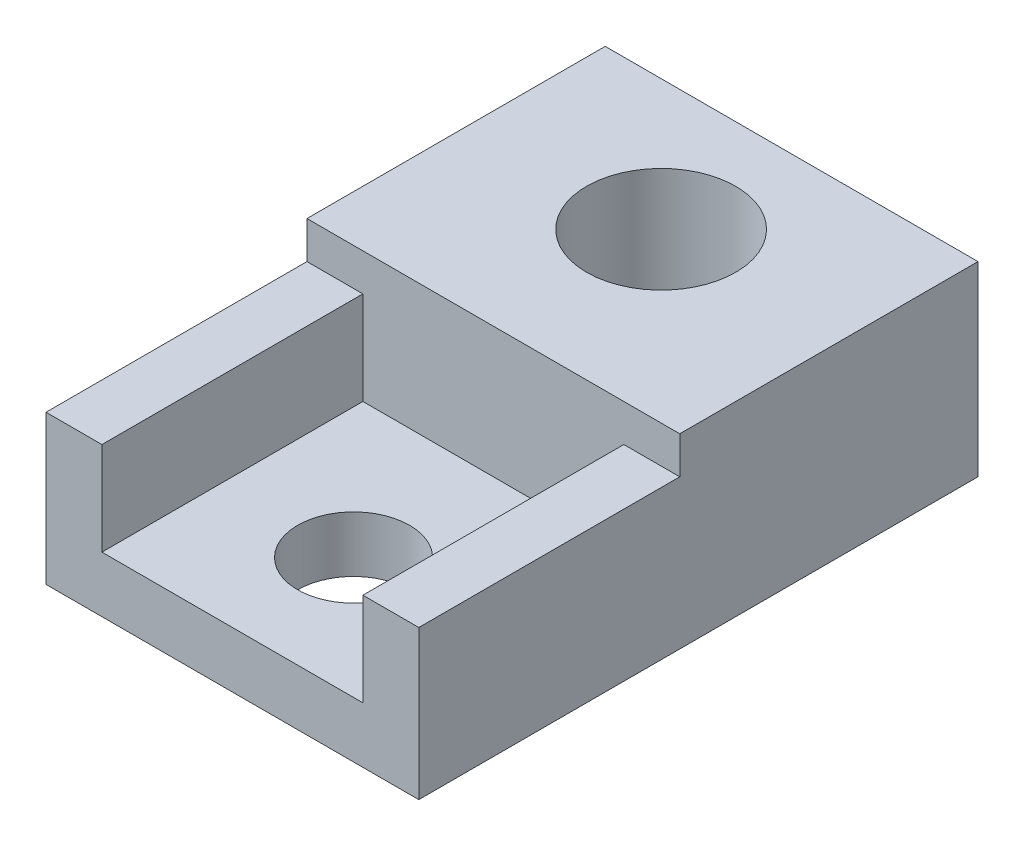
ISO-10303-21;
HEADER;
FILE_DESCRIPTION(('STEP AP214'),'2;1');
FILE_NAME('part.step','',(''),(''),'','','');
FILE_SCHEMA(('AUTOMOTIVE_DESIGN { 1 0 10303 214 1 1 1 1 }'));
ENDSEC;
DATA;
#1=APPLICATION_CONTEXT('core data for automotive mechanical design processes');
#2=APPLICATION_PROTOCOL_DEFINITION('international standard','automotive_design',2000,#1);
#3=PRODUCT_CONTEXT('',#1,'mechanical');
#4=PRODUCT('Part','Part','',(#3));
#5=PRODUCT_RELATED_PRODUCT_CATEGORY('part','',(#4));
#6=PRODUCT_DEFINITION_FORMATION('','',#4);
#7=PRODUCT_DEFINITION_CONTEXT('part definition',#1,'design');
#8=PRODUCT_DEFINITION('design','',#6,#7);
#9=PRODUCT_DEFINITION_SHAPE('','',#8);
#10=(LENGTH_UNIT() NAMED_UNIT(*) SI_UNIT(.MILLI.,.METRE.));
#11=(NAMED_UNIT(*) PLANE_ANGLE_UNIT() SI_UNIT($,.RADIAN.));
#12=(NAMED_UNIT(*) SI_UNIT($,.STERADIAN.) SOLID_ANGLE_UNIT());
#13=UNCERTAINTY_MEASURE_WITH_UNIT(LENGTH_MEASURE(1.E-05),#10,'distance_accuracy_value','');
#14=(GEOMETRIC_REPRESENTATION_CONTEXT(3) GLOBAL_UNCERTAINTY_ASSIGNED_CONTEXT((#13)) GLOBAL_UNIT_ASSIGNED_CONTEXT((#10,
#11,#12)) REPRESENTATION_CONTEXT('',''));
#15=CARTESIAN_POINT('',(0.,0.,0.));
#16=DIRECTION('',(0.,0.,1.));
#17=DIRECTION('',(1.,0.,0.));
#18=AXIS2_PLACEMENT_3D('',#15,#16,#17);
#19=CARTESIAN_POINT('',(0.,3.,0.));
#20=DIRECTION('',(0.,-1.,0.));
#21=DIRECTION('',(0.,0.,-1.));
#22=AXIS2_PLACEMENT_3D('',#19,#20,#21);
#23=PLANE('',#22);
#24=CARTESIAN_POINT('',(0.,3.,8.5));
#25=DIRECTION('',(0.,-1.,0.));
#26=DIRECTION('',(0.,0.,-1.));
#27=AXIS2_PLACEMENT_3D('',#24,#25,#26);
#28=CIRCLE('',#27,3.);
#29=CARTESIAN_POINT('',(0.,3.,5.5));
#30=VERTEX_POINT('',#29);
#31=EDGE_CURVE('E213',#30,#30,#28,.T.);
#32=ORIENTED_EDGE('',*,*,#31,.T.);
#33=EDGE_LOOP('',(#32));
#34=FACE_BOUND('',#33,.T.);
#35=DIRECTION('',(-1.,0.,0.));
#36=VECTOR('',#35,1.);
#37=CARTESIAN_POINT('',(7.,3.,15.));
#38=LINE('',#37,#36);
#39=CARTESIAN_POINT('',(7.,3.,15.));
#40=VERTEX_POINT('',#39);
#41=CARTESIAN_POINT('',(-7.,3.,15.));
#42=VERTEX_POINT('',#41);
#43=EDGE_CURVE('E317',#40,#42,#38,.T.);
#44=ORIENTED_EDGE('',*,*,#43,.F.);
#45=DIRECTION('',(0.,0.,-1.));
#46=VECTOR('',#45,1.);
#47=CARTESIAN_POINT('',(7.,3.,0.));
#48=LINE('',#47,#46);
#49=CARTESIAN_POINT('',(7.,3.,0.999999999999997));
#50=VERTEX_POINT('',#49);
#51=EDGE_CURVE('E174',#40,#50,#48,.T.);
#52=ORIENTED_EDGE('',*,*,#51,.T.);
#53=DIRECTION('',(1.,0.,0.));
#54=VECTOR('',#53,1.);
#55=CARTESIAN_POINT('',(0.,3.,0.999999999999997));
#56=LINE('',#55,#54);
#57=CARTESIAN_POINT('',(-7.,3.,0.999999999999997));
#58=VERTEX_POINT('',#57);
#59=EDGE_CURVE('E188',#58,#50,#56,.T.);
#60=ORIENTED_EDGE('',*,*,#59,.F.);
#61=DIRECTION('',(0.,0.,-1.));
#62=VECTOR('',#61,1.);
#63=CARTESIAN_POINT('',(-7.,3.,0.));
#64=LINE('',#63,#62);
#65=EDGE_CURVE('E287',#42,#58,#64,.T.);
#66=ORIENTED_EDGE('',*,*,#65,.F.);
#67=EDGE_LOOP('',(#44,#52,#60,#66));
#68=FACE_BOUND('',#67,.T.);
#69=ADVANCED_FACE('F40',(#34,#68),#23,.F.);
#70=CARTESIAN_POINT('',(0.,0.,0.));
#71=DIRECTION('',(0.,-1.,0.));
#72=DIRECTION('',(0.,0.,-1.));
#73=AXIS2_PLACEMENT_3D('',#70,#71,#72);
#74=PLANE('',#73);
#75=CARTESIAN_POINT('',(0.,0.,8.5));
#76=DIRECTION('',(0.,-1.,0.));
#77=DIRECTION('',(0.,0.,-1.));
#78=AXIS2_PLACEMENT_3D('',#75,#76,#77);
#79=CIRCLE('',#78,3.);
#80=CARTESIAN_POINT('',(0.,0.,5.5));
#81=VERTEX_POINT('',#80);
#82=EDGE_CURVE('E44',#81,#81,#79,.T.);
#83=ORIENTED_EDGE('',*,*,#82,.F.);
#84=EDGE_LOOP('',(#83));
#85=FACE_BOUND('',#84,.T.);
#86=DIRECTION('',(0.,0.,-1.));
#87=VECTOR('',#86,1.);
#88=CARTESIAN_POINT('',(10.,0.,15.));
#89=LINE('',#88,#87);
#90=CARTESIAN_POINT('',(10.,0.,15.));
#91=VERTEX_POINT('',#90);
#92=CARTESIAN_POINT('',(10.,0.,-15.));
#93=VERTEX_POINT('',#92);
#94=EDGE_CURVE('E262',#91,#93,#89,.T.);
#95=ORIENTED_EDGE('',*,*,#94,.F.);
#96=DIRECTION('',(1.,0.,0.));
#97=VECTOR('',#96,1.);
#98=CARTESIAN_POINT('',(-10.,0.,15.));
#99=LINE('',#98,#97);
#100=CARTESIAN_POINT('',(-10.,0.,15.));
#101=VERTEX_POINT('',#100);
#102=EDGE_CURVE('E148',#101,#91,#99,.T.);
#103=ORIENTED_EDGE('',*,*,#102,.F.);
#104=DIRECTION('',(0.,0.,1.));
#105=VECTOR('',#104,1.);
#106=CARTESIAN_POINT('',(-10.,0.,15.));
#107=LINE('',#106,#105);
#108=CARTESIAN_POINT('',(-10.,0.,-15.));
#109=VERTEX_POINT('',#108);
#110=EDGE_CURVE('E270',#109,#101,#107,.T.);
#111=ORIENTED_EDGE('',*,*,#110,.F.);
#112=DIRECTION('',(-1.,0.,0.));
#113=VECTOR('',#112,1.);
#114=CARTESIAN_POINT('',(-10.,0.,-15.));
#115=LINE('',#114,#113);
#116=CARTESIAN_POINT('',(-2.5,0.,-15.));
#117=VERTEX_POINT('',#116);
#118=EDGE_CURVE('E265',#117,#109,#115,.T.);
#119=ORIENTED_EDGE('',*,*,#118,.F.);
#120=DIRECTION('',(0.,0.,-1.));
#121=VECTOR('',#120,1.);
#122=CARTESIAN_POINT('',(-2.5,0.,-15.));
#123=LINE('',#122,#121);
#124=CARTESIAN_POINT('',(-2.5,0.,-3.));
#125=VERTEX_POINT('',#124);
#126=EDGE_CURVE('E227',#125,#117,#123,.T.);
#127=ORIENTED_EDGE('',*,*,#126,.F.);
#128=DIRECTION('',(-1.,0.,0.));
#129=VECTOR('',#128,1.);
#130=CARTESIAN_POINT('',(-2.5,0.,-3.));
#131=LINE('',#130,#129);
#132=CARTESIAN_POINT('',(2.5,0.,-3.));
#133=VERTEX_POINT('',#132);
#134=EDGE_CURVE('E240',#133,#125,#131,.T.);
#135=ORIENTED_EDGE('',*,*,#134,.F.);
#136=DIRECTION('',(0.,0.,1.));
#137=VECTOR('',#136,1.);
#138=CARTESIAN_POINT('',(2.5,0.,-15.));
#139=LINE('',#138,#137);
#140=CARTESIAN_POINT('',(2.5,0.,-15.));
#141=VERTEX_POINT('',#140);
#142=EDGE_CURVE('E221',#141,#133,#139,.T.);
#143=ORIENTED_EDGE('',*,*,#142,.F.);
#144=EDGE_CURVE('E266',#93,#141,#115,.T.);
#145=ORIENTED_EDGE('',*,*,#144,.F.);
#146=EDGE_LOOP('',(#95,#103,#111,#119,#127,#135,#143,#145));
#147=FACE_BOUND('',#146,.T.);
#148=ADVANCED_FACE('F284',(#85,#147),#74,.T.);
#149=CARTESIAN_POINT('',(10.,3.,15.));
#150=DIRECTION('',(-1.,0.,0.));
#151=DIRECTION('',(0.,0.,1.));
#152=AXIS2_PLACEMENT_3D('',#149,#150,#151);
#153=PLANE('',#152);
#154=DIRECTION('',(0.,1.,0.));
#155=VECTOR('',#154,1.);
#156=CARTESIAN_POINT('',(10.,0.,15.));
#157=LINE('',#156,#155);
#158=CARTESIAN_POINT('',(10.,8.,15.));
#159=VERTEX_POINT('',#158);
#160=EDGE_CURVE('E142',#91,#159,#157,.T.);
#161=ORIENTED_EDGE('',*,*,#160,.F.);
#162=ORIENTED_EDGE('',*,*,#94,.T.);
#163=DIRECTION('',(0.,-1.,0.));
#164=VECTOR('',#163,1.);
#165=CARTESIAN_POINT('',(10.,3.,-15.));
#166=LINE('',#165,#164);
#167=CARTESIAN_POINT('',(10.,10.,-15.));
#168=VERTEX_POINT('',#167);
#169=EDGE_CURVE('E11',#168,#93,#166,.T.);
#170=ORIENTED_EDGE('',*,*,#169,.F.);
#171=DIRECTION('',(0.,0.,-1.));
#172=VECTOR('',#171,1.);
#173=CARTESIAN_POINT('',(10.,10.,0.));
#174=LINE('',#173,#172);
#175=CARTESIAN_POINT('',(10.,10.,0.999999999999997));
#176=VERTEX_POINT('',#175);
#177=EDGE_CURVE('E202',#176,#168,#174,.T.);
#178=ORIENTED_EDGE('',*,*,#177,.F.);
#179=DIRECTION('',(0.,-1.,0.));
#180=VECTOR('',#179,1.);
#181=CARTESIAN_POINT('',(10.,35.6124969497314,0.999999999999997));
#182=LINE('',#181,#180);
#183=CARTESIAN_POINT('',(10.,8.,0.999999999999997));
#184=VERTEX_POINT('',#183);
#185=EDGE_CURVE('E166',#176,#184,#182,.T.);
#186=ORIENTED_EDGE('',*,*,#185,.T.);
#187=DIRECTION('',(0.,0.,-1.));
#188=VECTOR('',#187,1.);
#189=CARTESIAN_POINT('',(10.,8.,0.));
#190=LINE('',#189,#188);
#191=EDGE_CURVE('E158',#159,#184,#190,.T.);
#192=ORIENTED_EDGE('',*,*,#191,.F.);
#193=EDGE_LOOP('',(#161,#162,#170,#178,#186,#192));
#194=FACE_BOUND('',#193,.T.);
#195=ADVANCED_FACE('F42',(#194),#153,.F.);
#196=CARTESIAN_POINT('',(-10.,3.,15.));
#197=DIRECTION('',(1.,0.,0.));
#198=DIRECTION('',(0.,0.,-1.));
#199=AXIS2_PLACEMENT_3D('',#196,#197,#198);
#200=PLANE('',#199);
#201=DIRECTION('',(0.,-1.,0.));
#202=VECTOR('',#201,1.);
#203=CARTESIAN_POINT('',(-10.,8.,15.));
#204=LINE('',#203,#202);
#205=CARTESIAN_POINT('',(-10.,8.,15.));
#206=VERTEX_POINT('',#205);
#207=EDGE_CURVE('E288',#206,#101,#204,.T.);
#208=ORIENTED_EDGE('',*,*,#207,.F.);
#209=DIRECTION('',(0.,0.,1.));
#210=VECTOR('',#209,1.);
#211=CARTESIAN_POINT('',(-10.,8.,0.));
#212=LINE('',#211,#210);
#213=CARTESIAN_POINT('',(-10.,8.,0.999999999999997));
#214=VERTEX_POINT('',#213);
#215=EDGE_CURVE('E302',#214,#206,#212,.T.);
#216=ORIENTED_EDGE('',*,*,#215,.F.);
#217=DIRECTION('',(0.,-1.,0.));
#218=VECTOR('',#217,1.);
#219=CARTESIAN_POINT('',(-10.,35.6124969497314,0.999999999999997));
#220=LINE('',#219,#218);
#221=CARTESIAN_POINT('',(-10.,10.,0.999999999999997));
#222=VERTEX_POINT('',#221);
#223=EDGE_CURVE('E193',#222,#214,#220,.T.);
#224=ORIENTED_EDGE('',*,*,#223,.F.);
#225=DIRECTION('',(0.,0.,1.));
#226=VECTOR('',#225,1.);
#227=CARTESIAN_POINT('',(-10.,10.,0.));
#228=LINE('',#227,#226);
#229=CARTESIAN_POINT('',(-10.,10.,-15.));
#230=VERTEX_POINT('',#229);
#231=EDGE_CURVE('E194',#230,#222,#228,.T.);
#232=ORIENTED_EDGE('',*,*,#231,.F.);
#233=DIRECTION('',(0.,-1.,0.));
#234=VECTOR('',#233,1.);
#235=CARTESIAN_POINT('',(-10.,3.,-15.));
#236=LINE('',#235,#234);
#237=EDGE_CURVE('E50',#230,#109,#236,.T.);
#238=ORIENTED_EDGE('',*,*,#237,.T.);
#239=ORIENTED_EDGE('',*,*,#110,.T.);
#240=EDGE_LOOP('',(#208,#216,#224,#232,#238,#239));
#241=FACE_BOUND('',#240,.T.);
#242=ADVANCED_FACE('F280',(#241),#200,.F.);
#243=CARTESIAN_POINT('',(7.,8.,0.));
#244=DIRECTION('',(-1.,0.,0.));
#245=DIRECTION('',(0.,0.,1.));
#246=AXIS2_PLACEMENT_3D('',#243,#244,#245);
#247=PLANE('',#246);
#248=ORIENTED_EDGE('',*,*,#51,.F.);
#249=DIRECTION('',(0.,-1.,0.));
#250=VECTOR('',#249,1.);
#251=CARTESIAN_POINT('',(7.,8.,15.));
#252=LINE('',#251,#250);
#253=CARTESIAN_POINT('',(7.,8.,15.));
#254=VERTEX_POINT('',#253);
#255=EDGE_CURVE('E162',#254,#40,#252,.T.);
#256=ORIENTED_EDGE('',*,*,#255,.F.);
#257=DIRECTION('',(0.,0.,-1.));
#258=VECTOR('',#257,1.);
#259=CARTESIAN_POINT('',(7.,8.,0.));
#260=LINE('',#259,#258);
#261=CARTESIAN_POINT('',(7.,8.,0.999999999999997));
#262=VERTEX_POINT('',#261);
#263=EDGE_CURVE('E160',#254,#262,#260,.T.);
#264=ORIENTED_EDGE('',*,*,#263,.T.);
#265=DIRECTION('',(0.,-1.,0.));
#266=VECTOR('',#265,1.);
#267=CARTESIAN_POINT('',(7.,8.,0.999999999999997));
#268=LINE('',#267,#266);
#269=EDGE_CURVE('E172',#262,#50,#268,.T.);
#270=ORIENTED_EDGE('',*,*,#269,.T.);
#271=EDGE_LOOP('',(#248,#256,#264,#270));
#272=FACE_BOUND('',#271,.T.);
#273=ADVANCED_FACE('F319',(#272),#247,.T.);
#274=CARTESIAN_POINT('',(0.,8.,0.));
#275=DIRECTION('',(0.,1.,0.));
#276=DIRECTION('',(0.,0.,1.));
#277=AXIS2_PLACEMENT_3D('',#274,#275,#276);
#278=PLANE('',#277);
#279=ORIENTED_EDGE('',*,*,#263,.F.);
#280=DIRECTION('',(-1.,0.,0.));
#281=VECTOR('',#280,1.);
#282=CARTESIAN_POINT('',(10.,8.,15.));
#283=LINE('',#282,#281);
#284=EDGE_CURVE('E145',#159,#254,#283,.T.);
#285=ORIENTED_EDGE('',*,*,#284,.F.);
#286=ORIENTED_EDGE('',*,*,#191,.T.);
#287=DIRECTION('',(-1.,0.,0.));
#288=VECTOR('',#287,1.);
#289=CARTESIAN_POINT('',(0.,8.,0.999999999999997));
#290=LINE('',#289,#288);
#291=EDGE_CURVE('E168',#184,#262,#290,.T.);
#292=ORIENTED_EDGE('',*,*,#291,.T.);
#293=EDGE_LOOP('',(#279,#285,#286,#292));
#294=FACE_BOUND('',#293,.T.);
#295=ADVANCED_FACE('F156',(#294),#278,.T.);
#296=CARTESIAN_POINT('',(-7.,8.,0.));
#297=DIRECTION('',(-1.,0.,0.));
#298=DIRECTION('',(0.,0.,1.));
#299=AXIS2_PLACEMENT_3D('',#296,#297,#298);
#300=PLANE('',#299);
#301=DIRECTION('',(0.,1.,0.));
#302=VECTOR('',#301,1.);
#303=CARTESIAN_POINT('',(-7.,3.,15.));
#304=LINE('',#303,#302);
#305=CARTESIAN_POINT('',(-7.,8.,15.));
#306=VERTEX_POINT('',#305);
#307=EDGE_CURVE('E57',#42,#306,#304,.T.);
#308=ORIENTED_EDGE('',*,*,#307,.F.);
#309=ORIENTED_EDGE('',*,*,#65,.T.);
#310=DIRECTION('',(0.,-1.,0.));
#311=VECTOR('',#310,1.);
#312=CARTESIAN_POINT('',(-7.,8.,0.999999999999997));
#313=LINE('',#312,#311);
#314=CARTESIAN_POINT('',(-7.,8.,0.999999999999997));
#315=VERTEX_POINT('',#314);
#316=EDGE_CURVE('E180',#315,#58,#313,.T.);
#317=ORIENTED_EDGE('',*,*,#316,.F.);
#318=DIRECTION('',(0.,0.,-1.));
#319=VECTOR('',#318,1.);
#320=CARTESIAN_POINT('',(-7.,8.,0.));
#321=LINE('',#320,#319);
#322=EDGE_CURVE('E64',#306,#315,#321,.T.);
#323=ORIENTED_EDGE('',*,*,#322,.F.);
#324=EDGE_LOOP('',(#308,#309,#317,#323));
#325=FACE_BOUND('',#324,.T.);
#326=ADVANCED_FACE('F367',(#325),#300,.F.);
#327=CARTESIAN_POINT('',(0.,8.,0.));
#328=DIRECTION('',(0.,1.,0.));
#329=DIRECTION('',(0.,0.,1.));
#330=AXIS2_PLACEMENT_3D('',#327,#328,#329);
#331=PLANE('',#330);
#332=ORIENTED_EDGE('',*,*,#215,.T.);
#333=DIRECTION('',(-1.,0.,0.));
#334=VECTOR('',#333,1.);
#335=CARTESIAN_POINT('',(-7.,8.,15.));
#336=LINE('',#335,#334);
#337=EDGE_CURVE('E293',#306,#206,#336,.T.);
#338=ORIENTED_EDGE('',*,*,#337,.F.);
#339=ORIENTED_EDGE('',*,*,#322,.T.);
#340=DIRECTION('',(-1.,0.,0.));
#341=VECTOR('',#340,1.);
#342=CARTESIAN_POINT('',(0.,8.,0.999999999999997));
#343=LINE('',#342,#341);
#344=EDGE_CURVE('E299',#315,#214,#343,.T.);
#345=ORIENTED_EDGE('',*,*,#344,.T.);
#346=EDGE_LOOP('',(#332,#338,#339,#345));
#347=FACE_BOUND('',#346,.T.);
#348=ADVANCED_FACE('F363',(#347),#331,.T.);
#349=CARTESIAN_POINT('',(0.,35.6124969497314,0.999999999999997));
#350=DIRECTION('',(0.,0.,-1.));
#351=DIRECTION('',(-1.,0.,0.));
#352=AXIS2_PLACEMENT_3D('',#349,#350,#351);
#353=PLANE('',#352);
#354=ORIENTED_EDGE('',*,*,#316,.T.);
#355=ORIENTED_EDGE('',*,*,#59,.T.);
#356=ORIENTED_EDGE('',*,*,#269,.F.);
#357=ORIENTED_EDGE('',*,*,#291,.F.);
#358=ORIENTED_EDGE('',*,*,#185,.F.);
#359=DIRECTION('',(1.,0.,0.));
#360=VECTOR('',#359,1.);
#361=CARTESIAN_POINT('',(0.,10.,0.999999999999997));
#362=LINE('',#361,#360);
#363=EDGE_CURVE('E192',#222,#176,#362,.T.);
#364=ORIENTED_EDGE('',*,*,#363,.F.);
#365=ORIENTED_EDGE('',*,*,#223,.T.);
#366=ORIENTED_EDGE('',*,*,#344,.F.);
#367=EDGE_LOOP('',(#354,#355,#356,#357,#358,#364,#365,#366));
#368=FACE_BOUND('',#367,.T.);
#369=ADVANCED_FACE('F310',(#368),#353,.F.);
#370=CARTESIAN_POINT('',(-10.,3.,-15.));
#371=DIRECTION('',(0.,0.,1.));
#372=DIRECTION('',(1.,0.,0.));
#373=AXIS2_PLACEMENT_3D('',#370,#371,#372);
#374=PLANE('',#373);
#375=ORIENTED_EDGE('',*,*,#144,.T.);
#376=DIRECTION('',(0.,1.,0.));
#377=VECTOR('',#376,1.);
#378=CARTESIAN_POINT('',(2.5,-3.,-15.));
#379=LINE('',#378,#377);
#380=CARTESIAN_POINT('',(2.5,-3.,-15.));
#381=VERTEX_POINT('',#380);
#382=EDGE_CURVE('E236',#381,#141,#379,.T.);
#383=ORIENTED_EDGE('',*,*,#382,.F.);
#384=DIRECTION('',(1.,0.,0.));
#385=VECTOR('',#384,1.);
#386=CARTESIAN_POINT('',(-2.5,-3.,-15.));
#387=LINE('',#386,#385);
#388=CARTESIAN_POINT('',(-2.5,-3.,-15.));
#389=VERTEX_POINT('',#388);
#390=EDGE_CURVE('E233',#389,#381,#387,.T.);
#391=ORIENTED_EDGE('',*,*,#390,.F.);
#392=DIRECTION('',(0.,1.,0.));
#393=VECTOR('',#392,1.);
#394=CARTESIAN_POINT('',(-2.5,-3.,-15.));
#395=LINE('',#394,#393);
#396=EDGE_CURVE('E250',#389,#117,#395,.T.);
#397=ORIENTED_EDGE('',*,*,#396,.T.);
#398=ORIENTED_EDGE('',*,*,#118,.T.);
#399=ORIENTED_EDGE('',*,*,#237,.F.);
#400=DIRECTION('',(-1.,0.,0.));
#401=VECTOR('',#400,1.);
#402=CARTESIAN_POINT('',(0.,10.,-15.));
#403=LINE('',#402,#401);
#404=EDGE_CURVE('E198',#168,#230,#403,.T.);
#405=ORIENTED_EDGE('',*,*,#404,.F.);
#406=ORIENTED_EDGE('',*,*,#169,.T.);
#407=EDGE_LOOP('',(#375,#383,#391,#397,#398,#399,#405,#406));
#408=FACE_BOUND('',#407,.T.);
#409=ADVANCED_FACE('F324',(#408),#374,.F.);
#410=CARTESIAN_POINT('',(2.5,-3.,-15.));
#411=DIRECTION('',(-1.,0.,0.));
#412=DIRECTION('',(0.,0.,1.));
#413=AXIS2_PLACEMENT_3D('',#410,#411,#412);
#414=PLANE('',#413);
#415=ORIENTED_EDGE('',*,*,#142,.T.);
#416=DIRECTION('',(0.,1.,0.));
#417=VECTOR('',#416,1.);
#418=CARTESIAN_POINT('',(2.5,-3.,-3.));
#419=LINE('',#418,#417);
#420=CARTESIAN_POINT('',(2.5,-3.,-3.));
#421=VERTEX_POINT('',#420);
#422=EDGE_CURVE('E258',#421,#133,#419,.T.);
#423=ORIENTED_EDGE('',*,*,#422,.F.);
#424=DIRECTION('',(0.,0.,1.));
#425=VECTOR('',#424,1.);
#426=CARTESIAN_POINT('',(2.5,-3.,-15.));
#427=LINE('',#426,#425);
#428=EDGE_CURVE('E222',#381,#421,#427,.T.);
#429=ORIENTED_EDGE('',*,*,#428,.F.);
#430=ORIENTED_EDGE('',*,*,#382,.T.);
#431=EDGE_LOOP('',(#415,#423,#429,#430));
#432=FACE_BOUND('',#431,.T.);
#433=ADVANCED_FACE('F329',(#432),#414,.F.);
#434=CARTESIAN_POINT('',(-2.5,-3.,-3.));
#435=DIRECTION('',(0.,0.,-1.));
#436=DIRECTION('',(-1.,0.,0.));
#437=AXIS2_PLACEMENT_3D('',#434,#435,#436);
#438=PLANE('',#437);
#439=ORIENTED_EDGE('',*,*,#134,.T.);
#440=DIRECTION('',(0.,1.,0.));
#441=VECTOR('',#440,1.);
#442=CARTESIAN_POINT('',(-2.5,-3.,-3.));
#443=LINE('',#442,#441);
#444=CARTESIAN_POINT('',(-2.5,-3.,-3.));
#445=VERTEX_POINT('',#444);
#446=EDGE_CURVE('E254',#445,#125,#443,.T.);
#447=ORIENTED_EDGE('',*,*,#446,.F.);
#448=DIRECTION('',(-1.,0.,0.));
#449=VECTOR('',#448,1.);
#450=CARTESIAN_POINT('',(-2.5,-3.,-3.));
#451=LINE('',#450,#449);
#452=EDGE_CURVE('E226',#421,#445,#451,.T.);
#453=ORIENTED_EDGE('',*,*,#452,.F.);
#454=ORIENTED_EDGE('',*,*,#422,.T.);
#455=EDGE_LOOP('',(#439,#447,#453,#454));
#456=FACE_BOUND('',#455,.T.);
#457=ADVANCED_FACE('F339',(#456),#438,.F.);
#458=CARTESIAN_POINT('',(-2.5,-3.,-15.));
#459=DIRECTION('',(1.,0.,0.));
#460=DIRECTION('',(0.,0.,-1.));
#461=AXIS2_PLACEMENT_3D('',#458,#459,#460);
#462=PLANE('',#461);
#463=ORIENTED_EDGE('',*,*,#126,.T.);
#464=ORIENTED_EDGE('',*,*,#396,.F.);
#465=DIRECTION('',(0.,0.,-1.));
#466=VECTOR('',#465,1.);
#467=CARTESIAN_POINT('',(-2.5,-3.,-15.));
#468=LINE('',#467,#466);
#469=EDGE_CURVE('E230',#445,#389,#468,.T.);
#470=ORIENTED_EDGE('',*,*,#469,.F.);
#471=ORIENTED_EDGE('',*,*,#446,.T.);
#472=EDGE_LOOP('',(#463,#464,#470,#471));
#473=FACE_BOUND('',#472,.T.);
#474=ADVANCED_FACE('F337',(#473),#462,.F.);
#475=CARTESIAN_POINT('',(0.,-3.,0.));
#476=DIRECTION('',(0.,1.,0.));
#477=DIRECTION('',(0.,0.,1.));
#478=AXIS2_PLACEMENT_3D('',#475,#476,#477);
#479=PLANE('',#478);
#480=ORIENTED_EDGE('',*,*,#428,.T.);
#481=ORIENTED_EDGE('',*,*,#452,.T.);
#482=ORIENTED_EDGE('',*,*,#469,.T.);
#483=ORIENTED_EDGE('',*,*,#390,.T.);
#484=EDGE_LOOP('',(#480,#481,#482,#483));
#485=FACE_BOUND('',#484,.T.);
#486=ADVANCED_FACE('F332',(#485),#479,.F.);
#487=CARTESIAN_POINT('',(0.,-3.,8.5));
#488=DIRECTION('',(0.,1.,0.));
#489=DIRECTION('',(0.,0.,1.));
#490=AXIS2_PLACEMENT_3D('',#487,#488,#489);
#491=CYLINDRICAL_SURFACE('',#490,3.);
#492=ORIENTED_EDGE('',*,*,#82,.T.);
#493=EDGE_LOOP('',(#492));
#494=FACE_BOUND('',#493,.T.);
#495=ORIENTED_EDGE('',*,*,#31,.F.);
#496=EDGE_LOOP('',(#495));
#497=FACE_BOUND('',#496,.T.);
#498=ADVANCED_FACE('F373',(#494,#497),#491,.F.);
#499=CARTESIAN_POINT('',(0.,10.,-8.));
#500=DIRECTION('',(0.,-1.,0.));
#501=DIRECTION('',(0.,0.,-1.));
#502=AXIS2_PLACEMENT_3D('',#499,#500,#501);
#503=CYLINDRICAL_SURFACE('',#502,4.);
#504=CARTESIAN_POINT('',(0.,10.,-8.));
#505=DIRECTION('',(0.,1.,0.));
#506=DIRECTION('',(0.,0.,1.));
#507=AXIS2_PLACEMENT_3D('',#504,#505,#506);
#508=CIRCLE('',#507,4.);
#509=CARTESIAN_POINT('',(0.,10.,-4.));
#510=VERTEX_POINT('',#509);
#511=EDGE_CURVE('E217',#510,#510,#508,.T.);
#512=ORIENTED_EDGE('',*,*,#511,.T.);
#513=EDGE_LOOP('',(#512));
#514=FACE_BOUND('',#513,.T.);
#515=CARTESIAN_POINT('',(0.,2.5,-8.));
#516=DIRECTION('',(0.,1.,0.));
#517=DIRECTION('',(0.,0.,1.));
#518=AXIS2_PLACEMENT_3D('',#515,#516,#517);
#519=CIRCLE('',#518,4.);
#520=CARTESIAN_POINT('',(0.,2.5,-4.));
#521=VERTEX_POINT('',#520);
#522=EDGE_CURVE('E184',#521,#521,#519,.T.);
#523=ORIENTED_EDGE('',*,*,#522,.F.);
#524=EDGE_LOOP('',(#523));
#525=FACE_BOUND('',#524,.T.);
#526=ADVANCED_FACE('F376',(#514,#525),#503,.F.);
#527=CARTESIAN_POINT('',(0.,10.,-8.));
#528=DIRECTION('',(0.,1.,0.));
#529=DIRECTION('',(0.,0.,1.));
#530=AXIS2_PLACEMENT_3D('',#527,#528,#529);
#531=PLANE('',#530);
#532=ORIENTED_EDGE('',*,*,#404,.T.);
#533=ORIENTED_EDGE('',*,*,#231,.T.);
#534=ORIENTED_EDGE('',*,*,#363,.T.);
#535=ORIENTED_EDGE('',*,*,#177,.T.);
#536=EDGE_LOOP('',(#532,#533,#534,#535));
#537=FACE_BOUND('',#536,.T.);
#538=ORIENTED_EDGE('',*,*,#511,.F.);
#539=EDGE_LOOP('',(#538));
#540=FACE_BOUND('',#539,.T.);
#541=ADVANCED_FACE('F322',(#537,#540),#531,.T.);
#542=CARTESIAN_POINT('',(0.,2.5,-8.));
#543=DIRECTION('',(0.,1.,0.));
#544=DIRECTION('',(0.,0.,1.));
#545=AXIS2_PLACEMENT_3D('',#542,#543,#544);
#546=PLANE('',#545);
#547=ORIENTED_EDGE('',*,*,#522,.T.);
#548=EDGE_LOOP('',(#547));
#549=FACE_BOUND('',#548,.T.);
#550=ADVANCED_FACE('F371',(#549),#546,.T.);
#551=CARTESIAN_POINT('',(0.,0.,15.));
#552=DIRECTION('',(0.,0.,1.));
#553=DIRECTION('',(1.,0.,0.));
#554=AXIS2_PLACEMENT_3D('',#551,#552,#553);
#555=PLANE('',#554);
#556=ORIENTED_EDGE('',*,*,#160,.T.);
#557=ORIENTED_EDGE('',*,*,#284,.T.);
#558=ORIENTED_EDGE('',*,*,#255,.T.);
#559=ORIENTED_EDGE('',*,*,#43,.T.);
#560=ORIENTED_EDGE('',*,*,#307,.T.);
#561=ORIENTED_EDGE('',*,*,#337,.T.);
#562=ORIENTED_EDGE('',*,*,#207,.T.);
#563=ORIENTED_EDGE('',*,*,#102,.T.);
#564=EDGE_LOOP('',(#556,#557,#558,#559,#560,#561,#562,#563));
#565=FACE_BOUND('',#564,.T.);
#566=ADVANCED_FACE('F144',(#565),#555,.T.);
#567=CLOSED_SHELL('',(#69,#148,#195,#242,#273,#295,#326,#348,#369,#409,#433,#457,#474,#486,#498,
#526,#541,#550,#566));
#568=MANIFOLD_SOLID_BREP('B2',#567);
#569=ADVANCED_BREP_SHAPE_REPRESENTATION('',(#18,#568),#14);
#570=SHAPE_DEFINITION_REPRESENTATION(#9,#569);
ENDSEC;
END-ISO-10303-21;
